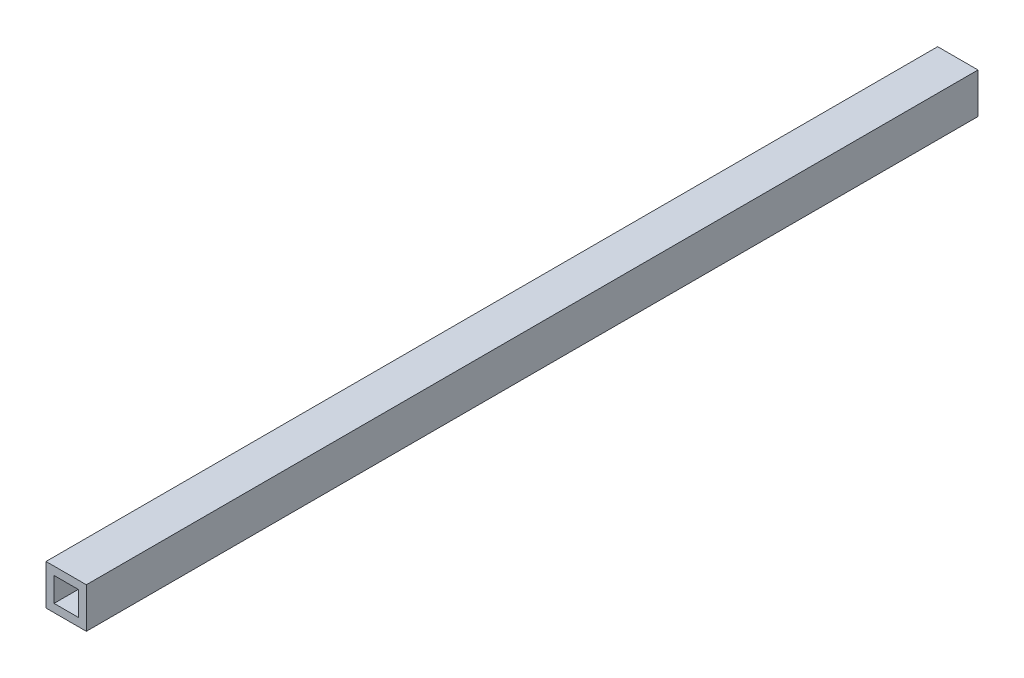
ISO-10303-21;
HEADER;
FILE_DESCRIPTION(('STEP AP214'),'2;1');
FILE_NAME('part.step','',(''),(''),'','','');
FILE_SCHEMA(('AUTOMOTIVE_DESIGN { 1 0 10303 214 1 1 1 1 }'));
ENDSEC;
DATA;
#1=APPLICATION_CONTEXT('core data for automotive mechanical design processes');
#2=APPLICATION_PROTOCOL_DEFINITION('international standard','automotive_design',2000,#1);
#3=PRODUCT_CONTEXT('',#1,'mechanical');
#4=PRODUCT('Part','Part','',(#3));
#5=PRODUCT_RELATED_PRODUCT_CATEGORY('part','',(#4));
#6=PRODUCT_DEFINITION_FORMATION('','',#4);
#7=PRODUCT_DEFINITION_CONTEXT('part definition',#1,'design');
#8=PRODUCT_DEFINITION('design','',#6,#7);
#9=PRODUCT_DEFINITION_SHAPE('','',#8);
#10=(LENGTH_UNIT() NAMED_UNIT(*) SI_UNIT(.MILLI.,.METRE.));
#11=(NAMED_UNIT(*) PLANE_ANGLE_UNIT() SI_UNIT($,.RADIAN.));
#12=(NAMED_UNIT(*) SI_UNIT($,.STERADIAN.) SOLID_ANGLE_UNIT());
#13=UNCERTAINTY_MEASURE_WITH_UNIT(LENGTH_MEASURE(1.E-05),#10,'distance_accuracy_value','');
#14=(GEOMETRIC_REPRESENTATION_CONTEXT(3) GLOBAL_UNCERTAINTY_ASSIGNED_CONTEXT((#13)) GLOBAL_UNIT_ASSIGNED_CONTEXT((#10,
#11,#12)) REPRESENTATION_CONTEXT('',''));
#15=CARTESIAN_POINT('',(0.,0.,0.));
#16=DIRECTION('',(0.,0.,1.));
#17=DIRECTION('',(1.,0.,0.));
#18=AXIS2_PLACEMENT_3D('',#15,#16,#17);
#19=CARTESIAN_POINT('',(0.,0.,221.));
#20=DIRECTION('',(0.,0.,-1.));
#21=DIRECTION('',(-1.,0.,0.));
#22=AXIS2_PLACEMENT_3D('',#19,#20,#21);
#23=PLANE('',#22);
#24=DIRECTION('',(0.,1.,0.));
#25=VECTOR('',#24,1.);
#26=CARTESIAN_POINT('',(5.,-5.,221.));
#27=LINE('',#26,#25);
#28=CARTESIAN_POINT('',(5.,-5.,221.));
#29=VERTEX_POINT('',#28);
#30=CARTESIAN_POINT('',(5.,5.,221.));
#31=VERTEX_POINT('',#30);
#32=EDGE_CURVE('E138',#29,#31,#27,.T.);
#33=ORIENTED_EDGE('',*,*,#32,.T.);
#34=DIRECTION('',(-1.,0.,0.));
#35=VECTOR('',#34,1.);
#36=CARTESIAN_POINT('',(-5.,5.,221.));
#37=LINE('',#36,#35);
#38=CARTESIAN_POINT('',(-5.,5.,221.));
#39=VERTEX_POINT('',#38);
#40=EDGE_CURVE('E141',#31,#39,#37,.T.);
#41=ORIENTED_EDGE('',*,*,#40,.T.);
#42=DIRECTION('',(0.,-1.,0.));
#43=VECTOR('',#42,1.);
#44=CARTESIAN_POINT('',(-5.,-5.,221.));
#45=LINE('',#44,#43);
#46=CARTESIAN_POINT('',(-5.,-5.,221.));
#47=VERTEX_POINT('',#46);
#48=EDGE_CURVE('E144',#39,#47,#45,.T.);
#49=ORIENTED_EDGE('',*,*,#48,.T.);
#50=DIRECTION('',(1.,0.,0.));
#51=VECTOR('',#50,1.);
#52=CARTESIAN_POINT('',(-5.,-5.,221.));
#53=LINE('',#52,#51);
#54=EDGE_CURVE('E146',#47,#29,#53,.T.);
#55=ORIENTED_EDGE('',*,*,#54,.T.);
#56=EDGE_LOOP('',(#33,#41,#49,#55));
#57=FACE_BOUND('',#56,.T.);
#58=DIRECTION('',(0.,-1.,0.));
#59=VECTOR('',#58,1.);
#60=CARTESIAN_POINT('',(-3.,-3.,221.));
#61=LINE('',#60,#59);
#62=CARTESIAN_POINT('',(-3.,3.,221.));
#63=VERTEX_POINT('',#62);
#64=CARTESIAN_POINT('',(-3.,-3.,221.));
#65=VERTEX_POINT('',#64);
#66=EDGE_CURVE('E102',#63,#65,#61,.T.);
#67=ORIENTED_EDGE('',*,*,#66,.F.);
#68=DIRECTION('',(-1.,0.,0.));
#69=VECTOR('',#68,1.);
#70=CARTESIAN_POINT('',(-3.,3.,221.));
#71=LINE('',#70,#69);
#72=CARTESIAN_POINT('',(3.,3.,221.));
#73=VERTEX_POINT('',#72);
#74=EDGE_CURVE('E124',#73,#63,#71,.T.);
#75=ORIENTED_EDGE('',*,*,#74,.F.);
#76=DIRECTION('',(0.,1.,0.));
#77=VECTOR('',#76,1.);
#78=CARTESIAN_POINT('',(3.,-3.,221.));
#79=LINE('',#78,#77);
#80=CARTESIAN_POINT('',(3.,-3.,221.));
#81=VERTEX_POINT('',#80);
#82=EDGE_CURVE('E122',#81,#73,#79,.T.);
#83=ORIENTED_EDGE('',*,*,#82,.F.);
#84=DIRECTION('',(1.,0.,0.));
#85=VECTOR('',#84,1.);
#86=CARTESIAN_POINT('',(-3.,-3.,221.));
#87=LINE('',#86,#85);
#88=EDGE_CURVE('E110',#65,#81,#87,.T.);
#89=ORIENTED_EDGE('',*,*,#88,.F.);
#90=EDGE_LOOP('',(#67,#75,#83,#89));
#91=FACE_BOUND('',#90,.T.);
#92=ADVANCED_FACE('F37',(#57,#91),#23,.F.);
#93=CARTESIAN_POINT('',(0.,0.,0.));
#94=DIRECTION('',(0.,0.,-1.));
#95=DIRECTION('',(-1.,0.,0.));
#96=AXIS2_PLACEMENT_3D('',#93,#94,#95);
#97=PLANE('',#96);
#98=DIRECTION('',(0.,1.,0.));
#99=VECTOR('',#98,1.);
#100=CARTESIAN_POINT('',(5.,-5.,0.));
#101=LINE('',#100,#99);
#102=CARTESIAN_POINT('',(5.,-5.,0.));
#103=VERTEX_POINT('',#102);
#104=CARTESIAN_POINT('',(5.,5.,0.));
#105=VERTEX_POINT('',#104);
#106=EDGE_CURVE('E118',#103,#105,#101,.T.);
#107=ORIENTED_EDGE('',*,*,#106,.F.);
#108=DIRECTION('',(1.,0.,0.));
#109=VECTOR('',#108,1.);
#110=CARTESIAN_POINT('',(-5.,-5.,0.));
#111=LINE('',#110,#109);
#112=CARTESIAN_POINT('',(-5.,-5.,0.));
#113=VERTEX_POINT('',#112);
#114=EDGE_CURVE('E142',#113,#103,#111,.T.);
#115=ORIENTED_EDGE('',*,*,#114,.F.);
#116=DIRECTION('',(0.,-1.,0.));
#117=VECTOR('',#116,1.);
#118=CARTESIAN_POINT('',(-5.,-5.,0.));
#119=LINE('',#118,#117);
#120=CARTESIAN_POINT('',(-5.,5.,0.));
#121=VERTEX_POINT('',#120);
#122=EDGE_CURVE('E153',#121,#113,#119,.T.);
#123=ORIENTED_EDGE('',*,*,#122,.F.);
#124=DIRECTION('',(-1.,0.,0.));
#125=VECTOR('',#124,1.);
#126=CARTESIAN_POINT('',(-5.,5.,0.));
#127=LINE('',#126,#125);
#128=EDGE_CURVE('E151',#105,#121,#127,.T.);
#129=ORIENTED_EDGE('',*,*,#128,.F.);
#130=EDGE_LOOP('',(#107,#115,#123,#129));
#131=FACE_BOUND('',#130,.T.);
#132=DIRECTION('',(-1.,0.,0.));
#133=VECTOR('',#132,1.);
#134=CARTESIAN_POINT('',(-3.,3.,0.));
#135=LINE('',#134,#133);
#136=CARTESIAN_POINT('',(3.,3.,0.));
#137=VERTEX_POINT('',#136);
#138=CARTESIAN_POINT('',(-3.,3.,0.));
#139=VERTEX_POINT('',#138);
#140=EDGE_CURVE('E111',#137,#139,#135,.T.);
#141=ORIENTED_EDGE('',*,*,#140,.T.);
#142=DIRECTION('',(0.,-1.,0.));
#143=VECTOR('',#142,1.);
#144=CARTESIAN_POINT('',(-3.,-3.,0.));
#145=LINE('',#144,#143);
#146=CARTESIAN_POINT('',(-3.,-3.,0.));
#147=VERTEX_POINT('',#146);
#148=EDGE_CURVE('E60',#139,#147,#145,.T.);
#149=ORIENTED_EDGE('',*,*,#148,.T.);
#150=DIRECTION('',(1.,0.,0.));
#151=VECTOR('',#150,1.);
#152=CARTESIAN_POINT('',(-3.,-3.,0.));
#153=LINE('',#152,#151);
#154=CARTESIAN_POINT('',(3.,-3.,0.));
#155=VERTEX_POINT('',#154);
#156=EDGE_CURVE('E117',#147,#155,#153,.T.);
#157=ORIENTED_EDGE('',*,*,#156,.T.);
#158=DIRECTION('',(0.,1.,0.));
#159=VECTOR('',#158,1.);
#160=CARTESIAN_POINT('',(3.,-3.,0.));
#161=LINE('',#160,#159);
#162=EDGE_CURVE('E130',#155,#137,#161,.T.);
#163=ORIENTED_EDGE('',*,*,#162,.T.);
#164=EDGE_LOOP('',(#141,#149,#157,#163));
#165=FACE_BOUND('',#164,.T.);
#166=ADVANCED_FACE('F171',(#131,#165),#97,.T.);
#167=CARTESIAN_POINT('',(5.,-5.,221.));
#168=DIRECTION('',(-1.,0.,0.));
#169=DIRECTION('',(0.,-1.,0.));
#170=AXIS2_PLACEMENT_3D('',#167,#168,#169);
#171=PLANE('',#170);
#172=ORIENTED_EDGE('',*,*,#106,.T.);
#173=DIRECTION('',(0.,0.,-1.));
#174=VECTOR('',#173,1.);
#175=CARTESIAN_POINT('',(5.,5.,221.));
#176=LINE('',#175,#174);
#177=EDGE_CURVE('E11',#31,#105,#176,.T.);
#178=ORIENTED_EDGE('',*,*,#177,.F.);
#179=ORIENTED_EDGE('',*,*,#32,.F.);
#180=DIRECTION('',(0.,0.,-1.));
#181=VECTOR('',#180,1.);
#182=CARTESIAN_POINT('',(5.,-5.,221.));
#183=LINE('',#182,#181);
#184=EDGE_CURVE('E148',#29,#103,#183,.T.);
#185=ORIENTED_EDGE('',*,*,#184,.T.);
#186=EDGE_LOOP('',(#172,#178,#179,#185));
#187=FACE_BOUND('',#186,.T.);
#188=ADVANCED_FACE('F39',(#187),#171,.F.);
#189=CARTESIAN_POINT('',(-5.,5.,221.));
#190=DIRECTION('',(0.,-1.,0.));
#191=DIRECTION('',(1.,0.,0.));
#192=AXIS2_PLACEMENT_3D('',#189,#190,#191);
#193=PLANE('',#192);
#194=ORIENTED_EDGE('',*,*,#128,.T.);
#195=DIRECTION('',(0.,0.,-1.));
#196=VECTOR('',#195,1.);
#197=CARTESIAN_POINT('',(-5.,5.,221.));
#198=LINE('',#197,#196);
#199=EDGE_CURVE('E45',#39,#121,#198,.T.);
#200=ORIENTED_EDGE('',*,*,#199,.F.);
#201=ORIENTED_EDGE('',*,*,#40,.F.);
#202=ORIENTED_EDGE('',*,*,#177,.T.);
#203=EDGE_LOOP('',(#194,#200,#201,#202));
#204=FACE_BOUND('',#203,.T.);
#205=ADVANCED_FACE('F181',(#204),#193,.F.);
#206=CARTESIAN_POINT('',(-5.,-5.,221.));
#207=DIRECTION('',(1.,0.,0.));
#208=DIRECTION('',(0.,1.,0.));
#209=AXIS2_PLACEMENT_3D('',#206,#207,#208);
#210=PLANE('',#209);
#211=ORIENTED_EDGE('',*,*,#122,.T.);
#212=DIRECTION('',(0.,0.,-1.));
#213=VECTOR('',#212,1.);
#214=CARTESIAN_POINT('',(-5.,-5.,221.));
#215=LINE('',#214,#213);
#216=EDGE_CURVE('E158',#47,#113,#215,.T.);
#217=ORIENTED_EDGE('',*,*,#216,.F.);
#218=ORIENTED_EDGE('',*,*,#48,.F.);
#219=ORIENTED_EDGE('',*,*,#199,.T.);
#220=EDGE_LOOP('',(#211,#217,#218,#219));
#221=FACE_BOUND('',#220,.T.);
#222=ADVANCED_FACE('F165',(#221),#210,.F.);
#223=CARTESIAN_POINT('',(-5.,-5.,221.));
#224=DIRECTION('',(0.,1.,0.));
#225=DIRECTION('',(-1.,0.,0.));
#226=AXIS2_PLACEMENT_3D('',#223,#224,#225);
#227=PLANE('',#226);
#228=ORIENTED_EDGE('',*,*,#114,.T.);
#229=ORIENTED_EDGE('',*,*,#184,.F.);
#230=ORIENTED_EDGE('',*,*,#54,.F.);
#231=ORIENTED_EDGE('',*,*,#216,.T.);
#232=EDGE_LOOP('',(#228,#229,#230,#231));
#233=FACE_BOUND('',#232,.T.);
#234=ADVANCED_FACE('F175',(#233),#227,.F.);
#235=CARTESIAN_POINT('',(-3.,-3.,221.));
#236=DIRECTION('',(1.,0.,0.));
#237=DIRECTION('',(0.,0.,-1.));
#238=AXIS2_PLACEMENT_3D('',#235,#236,#237);
#239=PLANE('',#238);
#240=ORIENTED_EDGE('',*,*,#148,.F.);
#241=DIRECTION('',(0.,0.,-1.));
#242=VECTOR('',#241,1.);
#243=CARTESIAN_POINT('',(-3.,3.,221.));
#244=LINE('',#243,#242);
#245=EDGE_CURVE('E106',#63,#139,#244,.T.);
#246=ORIENTED_EDGE('',*,*,#245,.F.);
#247=ORIENTED_EDGE('',*,*,#66,.T.);
#248=DIRECTION('',(0.,0.,-1.));
#249=VECTOR('',#248,1.);
#250=CARTESIAN_POINT('',(-3.,-3.,221.));
#251=LINE('',#250,#249);
#252=EDGE_CURVE('E105',#65,#147,#251,.T.);
#253=ORIENTED_EDGE('',*,*,#252,.T.);
#254=EDGE_LOOP('',(#240,#246,#247,#253));
#255=FACE_BOUND('',#254,.T.);
#256=ADVANCED_FACE('F104',(#255),#239,.T.);
#257=CARTESIAN_POINT('',(-3.,-3.,221.));
#258=DIRECTION('',(0.,1.,0.));
#259=DIRECTION('',(0.,0.,1.));
#260=AXIS2_PLACEMENT_3D('',#257,#258,#259);
#261=PLANE('',#260);
#262=ORIENTED_EDGE('',*,*,#156,.F.);
#263=ORIENTED_EDGE('',*,*,#252,.F.);
#264=ORIENTED_EDGE('',*,*,#88,.T.);
#265=DIRECTION('',(0.,0.,-1.));
#266=VECTOR('',#265,1.);
#267=CARTESIAN_POINT('',(3.,-3.,221.));
#268=LINE('',#267,#266);
#269=EDGE_CURVE('E119',#81,#155,#268,.T.);
#270=ORIENTED_EDGE('',*,*,#269,.T.);
#271=EDGE_LOOP('',(#262,#263,#264,#270));
#272=FACE_BOUND('',#271,.T.);
#273=ADVANCED_FACE('F114',(#272),#261,.T.);
#274=CARTESIAN_POINT('',(3.,-3.,221.));
#275=DIRECTION('',(-1.,0.,0.));
#276=DIRECTION('',(0.,0.,1.));
#277=AXIS2_PLACEMENT_3D('',#274,#275,#276);
#278=PLANE('',#277);
#279=ORIENTED_EDGE('',*,*,#162,.F.);
#280=ORIENTED_EDGE('',*,*,#269,.F.);
#281=ORIENTED_EDGE('',*,*,#82,.T.);
#282=DIRECTION('',(0.,0.,-1.));
#283=VECTOR('',#282,1.);
#284=CARTESIAN_POINT('',(3.,3.,221.));
#285=LINE('',#284,#283);
#286=EDGE_CURVE('E52',#73,#137,#285,.T.);
#287=ORIENTED_EDGE('',*,*,#286,.T.);
#288=EDGE_LOOP('',(#279,#280,#281,#287));
#289=FACE_BOUND('',#288,.T.);
#290=ADVANCED_FACE('F204',(#289),#278,.T.);
#291=CARTESIAN_POINT('',(-3.,3.,221.));
#292=DIRECTION('',(0.,-1.,0.));
#293=DIRECTION('',(1.,0.,0.));
#294=AXIS2_PLACEMENT_3D('',#291,#292,#293);
#295=PLANE('',#294);
#296=ORIENTED_EDGE('',*,*,#140,.F.);
#297=ORIENTED_EDGE('',*,*,#286,.F.);
#298=ORIENTED_EDGE('',*,*,#74,.T.);
#299=ORIENTED_EDGE('',*,*,#245,.T.);
#300=EDGE_LOOP('',(#296,#297,#298,#299));
#301=FACE_BOUND('',#300,.T.);
#302=ADVANCED_FACE('F208',(#301),#295,.T.);
#303=CLOSED_SHELL('',(#92,#166,#188,#205,#222,#234,#256,#273,#290,#302));
#304=MANIFOLD_SOLID_BREP('B2',#303);
#305=ADVANCED_BREP_SHAPE_REPRESENTATION('',(#18,#304),#14);
#306=SHAPE_DEFINITION_REPRESENTATION(#9,#305);
ENDSEC;
END-ISO-10303-21;
